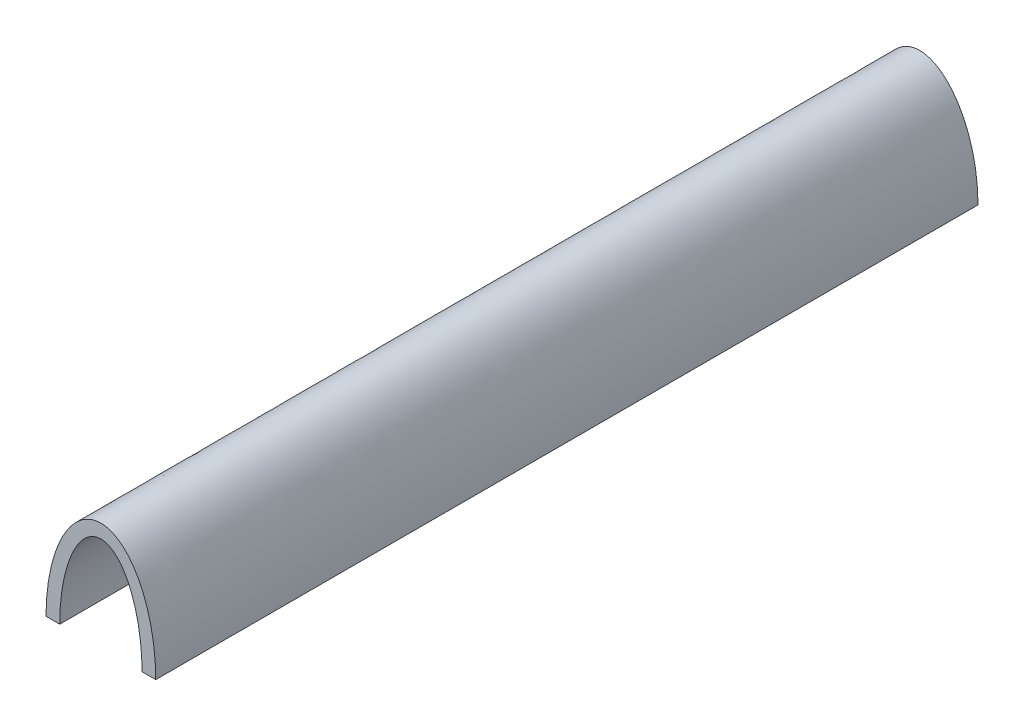
ISO-10303-21;
HEADER;
FILE_DESCRIPTION(('STEP AP214'),'2;1');
FILE_NAME('part.step','',(''),(''),'','','');
FILE_SCHEMA(('AUTOMOTIVE_DESIGN { 1 0 10303 214 1 1 1 1 }'));
ENDSEC;
DATA;
#1=APPLICATION_CONTEXT('core data for automotive mechanical design processes');
#2=APPLICATION_PROTOCOL_DEFINITION('international standard','automotive_design',2000,#1);
#3=PRODUCT_CONTEXT('',#1,'mechanical');
#4=PRODUCT('Part','Part','',(#3));
#5=PRODUCT_RELATED_PRODUCT_CATEGORY('part','',(#4));
#6=PRODUCT_DEFINITION_FORMATION('','',#4);
#7=PRODUCT_DEFINITION_CONTEXT('part definition',#1,'design');
#8=PRODUCT_DEFINITION('design','',#6,#7);
#9=PRODUCT_DEFINITION_SHAPE('','',#8);
#10=(LENGTH_UNIT() NAMED_UNIT(*) SI_UNIT(.MILLI.,.METRE.));
#11=(NAMED_UNIT(*) PLANE_ANGLE_UNIT() SI_UNIT($,.RADIAN.));
#12=(NAMED_UNIT(*) SI_UNIT($,.STERADIAN.) SOLID_ANGLE_UNIT());
#13=UNCERTAINTY_MEASURE_WITH_UNIT(LENGTH_MEASURE(1.E-05),#10,'distance_accuracy_value','');
#14=(GEOMETRIC_REPRESENTATION_CONTEXT(3) GLOBAL_UNCERTAINTY_ASSIGNED_CONTEXT((#13)) GLOBAL_UNIT_ASSIGNED_CONTEXT((#10,
#11,#12)) REPRESENTATION_CONTEXT('',''));
#15=CARTESIAN_POINT('',(0.,0.,0.));
#16=DIRECTION('',(0.,0.,1.));
#17=DIRECTION('',(1.,0.,0.));
#18=AXIS2_PLACEMENT_3D('',#15,#16,#17);
#19=CARTESIAN_POINT('',(-15.,0.,-160.401));
#20=DIRECTION('',(0.,-1.,0.));
#21=DIRECTION('',(1.,0.,0.));
#22=AXIS2_PLACEMENT_3D('',#19,#20,#21);
#23=PLANE('',#22);
#24=DIRECTION('',(1.,0.,0.));
#25=VECTOR('',#24,1.);
#26=CARTESIAN_POINT('',(20.,0.,458.85));
#27=LINE('',#26,#25);
#28=CARTESIAN_POINT('',(-20.,0.,458.85));
#29=VERTEX_POINT('',#28);
#30=CARTESIAN_POINT('',(-15.,0.,458.85));
#31=VERTEX_POINT('',#30);
#32=EDGE_CURVE('E39',#29,#31,#27,.T.);
#33=ORIENTED_EDGE('',*,*,#32,.F.);
#34=DIRECTION('',(0.,0.,1.));
#35=VECTOR('',#34,1.);
#36=CARTESIAN_POINT('',(-20.,0.,-160.401));
#37=LINE('',#36,#35);
#38=CARTESIAN_POINT('',(-20.,0.,159.148232789434));
#39=VERTEX_POINT('',#38);
#40=EDGE_CURVE('E45',#39,#29,#37,.T.);
#41=ORIENTED_EDGE('',*,*,#40,.F.);
#42=CARTESIAN_POINT('',(0.,0.,0.));
#43=DIRECTION('',(0.,-1.,0.));
#44=DIRECTION('',(1.,0.,0.));
#45=AXIS2_PLACEMENT_3D('',#42,#43,#44);
#46=CIRCLE('',#45,160.4);
#47=CARTESIAN_POINT('',(-15.,0.,159.697088264001));
#48=VERTEX_POINT('',#47);
#49=EDGE_CURVE('E60',#39,#48,#46,.F.);
#50=ORIENTED_EDGE('',*,*,#49,.T.);
#51=DIRECTION('',(0.,0.,1.));
#52=VECTOR('',#51,1.);
#53=CARTESIAN_POINT('',(-15.,0.,-160.401));
#54=LINE('',#53,#52);
#55=EDGE_CURVE('E86',#48,#31,#54,.T.);
#56=ORIENTED_EDGE('',*,*,#55,.T.);
#57=EDGE_LOOP('',(#33,#41,#50,#56));
#58=FACE_BOUND('',#57,.T.);
#59=ADVANCED_FACE('F33',(#58),#23,.T.);
#60=CARTESIAN_POINT('',(0.,0.,-160.401));
#61=DIRECTION('',(0.,0.,-1.));
#62=DIRECTION('',(0.,1.,0.));
#63=AXIS2_PLACEMENT_3D('',#60,#61,#62);
#64=ELLIPSE('',#63,34.3979999999999,15.);
#65=DIRECTION('',(0.,0.,1.));
#66=VECTOR('',#65,1.);
#67=SURFACE_OF_LINEAR_EXTRUSION('',#64,#66);
#68=CARTESIAN_POINT('',(0.,0.,458.85));
#69=DIRECTION('',(0.,0.,-1.));
#70=DIRECTION('',(0.,1.,0.));
#71=AXIS2_PLACEMENT_3D('',#68,#69,#70);
#72=ELLIPSE('',#71,34.3979999999999,15.);
#73=CARTESIAN_POINT('',(15.,0.,458.85));
#74=VERTEX_POINT('',#73);
#75=EDGE_CURVE('E87',#31,#74,#72,.T.);
#76=ORIENTED_EDGE('',*,*,#75,.F.);
#77=ORIENTED_EDGE('',*,*,#55,.F.);
#78=CARTESIAN_POINT('',(-15.,0.,159.697088264001));
#79=CARTESIAN_POINT('',(-14.9999784975551,0.65342143765804,159.697087543376));
#80=CARTESIAN_POINT('',(-14.9918800790665,1.30684677427651,159.697850840117));
#81=CARTESIAN_POINT('',(-14.9593754990692,2.61331091957095,159.700900393056));
#82=CARTESIAN_POINT('',(-14.9349687527799,3.26634971354588,159.703186703867));
#83=CARTESIAN_POINT('',(-14.8696766584003,4.57193800651891,159.709278788404));
#84=CARTESIAN_POINT('',(-14.8287827703025,5.22448707608199,159.713085349581));
#85=CARTESIAN_POINT('',(-14.7302048892875,6.52830242570223,159.722207391437));
#86=CARTESIAN_POINT('',(-14.6725210559618,7.17956871789319,159.727522857775));
#87=CARTESIAN_POINT('',(-14.5399114981972,8.48044949312844,159.739648826999));
#88=CARTESIAN_POINT('',(-14.4649827619125,9.13006366756694,159.746459591031));
#89=CARTESIAN_POINT('',(-14.2972941966738,10.4269697973111,159.761555056743));
#90=CARTESIAN_POINT('',(-14.2045345562766,11.0742617770996,159.769839742838));
#91=CARTESIAN_POINT('',(-14.0004090854731,12.3659166830814,159.787856384428));
#92=CARTESIAN_POINT('',(-13.8890425729356,13.0102795010013,159.797588392983));
#93=CARTESIAN_POINT('',(-13.6467316358289,14.295285239232,159.818464299497));
#94=CARTESIAN_POINT('',(-13.5157879659255,14.9359283019444,159.829608143031));
#95=CARTESIAN_POINT('',(-13.2687962896641,16.0513291448052,159.850274477679));
#96=CARTESIAN_POINT('',(-13.1573407691815,16.5271120686235,159.859495466801));
#97=CARTESIAN_POINT('',(-12.9221771974742,17.4756191936269,159.878676703224));
#98=CARTESIAN_POINT('',(-12.7984695046772,17.9483434838591,159.888636928897));
#99=CARTESIAN_POINT('',(-12.5381544607662,18.8898632866598,159.909260947271));
#100=CARTESIAN_POINT('',(-12.4015563433081,19.358661353483,159.919924234731));
#101=CARTESIAN_POINT('',(-12.1145179676262,20.291960338124,159.941924225481));
#102=CARTESIAN_POINT('',(-11.9640780963023,20.7564613756516,159.953260909945));
#103=CARTESIAN_POINT('',(-11.5712452595289,21.9059542244127,159.982255629428));
#104=CARTESIAN_POINT('',(-11.319810805316,22.5879050435346,160.000298264767));
#105=CARTESIAN_POINT('',(-10.9145428474105,23.6002082522044,160.028281818679));
#106=CARTESIAN_POINT('',(-10.7746210023215,23.9361865829204,160.037772400873));
#107=CARTESIAN_POINT('',(-10.4847704549664,24.603782041599,160.057023362603));
#108=CARTESIAN_POINT('',(-10.3348424691774,24.9353994797868,160.066783722792));
#109=CARTESIAN_POINT('',(-10.0204726238599,25.6015037033944,160.086774997878));
#110=CARTESIAN_POINT('',(-9.8557677552698,25.935866484536,160.097011584216));
#111=CARTESIAN_POINT('',(-9.51410448011058,26.5983400256239,160.11767897446));
#112=CARTESIAN_POINT('',(-9.33714450427164,26.9264499780088,160.128109803113));
#113=CARTESIAN_POINT('',(-8.96982758969165,27.5752858615737,160.149105703649));
#114=CARTESIAN_POINT('',(-8.77946510000341,27.896008659345,160.159670829651));
#115=CARTESIAN_POINT('',(-8.38459805007888,28.5276606081354,160.18082760338));
#116=CARTESIAN_POINT('',(-8.18012630862486,28.8386101909142,160.191419137773));
#117=CARTESIAN_POINT('',(-7.75530919077876,29.4493687130793,160.212547590858));
#118=CARTESIAN_POINT('',(-7.53496897633811,29.7491812276347,160.223084526128));
#119=CARTESIAN_POINT('',(-7.0769075190019,30.3349810431125,160.243970044648));
#120=CARTESIAN_POINT('',(-6.83919934567137,30.6209784762103,160.254318762357));
#121=CARTESIAN_POINT('',(-6.41396402380304,31.0980468433213,160.271808907401));
#122=CARTESIAN_POINT('',(-6.23106537594444,31.293241255501,160.279035698137));
#123=CARTESIAN_POINT('',(-5.85465695055068,31.6731750798582,160.293226539017));
#124=CARTESIAN_POINT('',(-5.66114739273328,31.8579147083598,160.300190594594));
#125=CARTESIAN_POINT('',(-5.26297287175353,32.2149138995068,160.313757318548));
#126=CARTESIAN_POINT('',(-5.05831086934248,32.3871767464751,160.320360081915));
#127=CARTESIAN_POINT('',(-4.63732348729601,32.7168752280081,160.333089415243));
#128=CARTESIAN_POINT('',(-4.42099975034745,32.8743129423229,160.339216051976));
#129=CARTESIAN_POINT('',(-4.0105112563571,33.1487781126818,160.349964906802));
#130=CARTESIAN_POINT('',(-3.81802179495408,33.2683025793105,160.354673868227));
#131=CARTESIAN_POINT('',(-3.42468906539296,33.4926983751485,160.3635562644));
#132=CARTESIAN_POINT('',(-3.22384813272875,33.5975737656916,160.36772984755));
#133=CARTESIAN_POINT('',(-2.8144674930993,33.7904696576536,160.375436477919));
#134=CARTESIAN_POINT('',(-2.60593728909384,33.8785101836218,160.378970285861));
#135=CARTESIAN_POINT('',(-2.18185654152479,34.0357230563317,160.385299903719));
#136=CARTESIAN_POINT('',(-1.96630751661237,34.1048994547059,160.388095872105));
#137=CARTESIAN_POINT('',(-1.56663767526799,34.2124375921232,160.392451641299));
#138=CARTESIAN_POINT('',(-1.38338694018583,34.2540357349852,160.394140673959));
#139=CARTESIAN_POINT('',(-1.01406477385361,34.3219324489244,160.396900699211));
#140=CARTESIAN_POINT('',(-0.827993651654338,34.3482326840482,160.397971759025));
#141=CARTESIAN_POINT('',(-0.454364770533323,34.3848879643377,160.399465195958));
#142=CARTESIAN_POINT('',(-0.266807741603291,34.3952504036748,160.399887873887));
#143=CARTESIAN_POINT('',(0.108508977346256,34.3997918538337,160.400073069847));
#144=CARTESIAN_POINT('',(0.296268672403645,34.3939704526438,160.39983557107));
#145=CARTESIAN_POINT('',(0.670410131620379,34.3663049092713,160.398707960718));
#146=CARTESIAN_POINT('',(0.856793063102839,34.3444764317277,160.397818487169));
#147=CARTESIAN_POINT('',(1.22706699508122,34.2853535764004,160.395413248255));
#148=CARTESIAN_POINT('',(1.41095803633666,34.2480594519026,160.393897493147));
#149=CARTESIAN_POINT('',(1.77525623638912,34.1588321910972,160.390279234179));
#150=CARTESIAN_POINT('',(1.95566108737648,34.1068896901012,160.388176354981));
#151=CARTESIAN_POINT('',(2.31201066613865,33.989450812235,160.383435509002));
#152=CARTESIAN_POINT('',(2.48795424409261,33.9239509802498,160.380797405821));
#153=CARTESIAN_POINT('',(2.90112879401637,33.7531295322364,160.373940950107));
#154=CARTESIAN_POINT('',(3.1360353307911,33.6421626616487,160.369504274004));
#155=CARTESIAN_POINT('',(3.59500604380829,33.3998474927477,160.359872431743));
#156=CARTESIAN_POINT('',(3.81906611710066,33.2684915595776,160.354676981499));
#157=CARTESIAN_POINT('',(4.47520267853596,32.8479639735701,160.338156287505));
#158=CARTESIAN_POINT('',(4.89068277109205,32.5325741897963,160.325906516323));
#159=CARTESIAN_POINT('',(5.44786435829338,32.0516350909398,160.307540579025));
#160=CARTESIAN_POINT('',(5.60779448063387,31.9060991504798,160.30201854851));
#161=CARTESIAN_POINT('',(5.92053786885692,31.6075743052417,160.29077231437));
#162=CARTESIAN_POINT('',(6.07335259498055,31.4545869429683,160.285048152655));
#163=CARTESIAN_POINT('',(6.5217982399784,30.9857308318328,160.267638258022));
#164=CARTESIAN_POINT('',(6.80725795512427,30.6601198361694,160.255720935196));
#165=CARTESIAN_POINT('',(7.35419871687169,29.9885453274334,160.231553609287));
#166=CARTESIAN_POINT('',(7.61563210558807,29.642543506556,160.219303004916));
#167=CARTESIAN_POINT('',(8.11649577122827,28.9351465593391,160.194710659406));
#168=CARTESIAN_POINT('',(8.3559301267817,28.5737543046493,160.18236893562));
#169=CARTESIAN_POINT('',(8.81793256109715,27.8342323620122,160.157604292512));
#170=CARTESIAN_POINT('',(9.04025762419912,27.4559517078691,160.145182235188));
#171=CARTESIAN_POINT('',(9.4668754185498,26.6891191263502,160.120529364611));
#172=CARTESIAN_POINT('',(9.67115801913654,26.3005615857119,160.108298661934));
#173=CARTESIAN_POINT('',(10.0633759224214,25.515010213893,160.084124999376));
#174=CARTESIAN_POINT('',(10.2513012074375,25.1180113956395,160.072182219019));
#175=CARTESIAN_POINT('',(10.6121119404103,24.3172319689039,160.048666823684));
#176=CARTESIAN_POINT('',(10.7849968246209,23.9134511068925,160.037094222591));
#177=CARTESIAN_POINT('',(11.1177624404058,23.0982193007242,160.014322173551));
#178=CARTESIAN_POINT('',(11.277573982482,22.6867401385426,160.003124875597));
#179=CARTESIAN_POINT('',(11.5841960222741,21.8591920863931,159.98121766676));
#180=CARTESIAN_POINT('',(11.7310127426551,21.4431255016663,159.970507523808));
#181=CARTESIAN_POINT('',(12.0125957685302,20.6070006319153,159.949609153573));
#182=CARTESIAN_POINT('',(12.1473639016847,20.1869429630331,159.939420847232));
#183=CARTESIAN_POINT('',(12.4056235637172,19.3433824788189,159.919596231425));
#184=CARTESIAN_POINT('',(12.5291153024456,18.9198797277588,159.909959911686));
#185=CARTESIAN_POINT('',(12.8163045489906,17.8871344304275,159.887245096027));
#186=CARTESIAN_POINT('',(12.9744537751133,17.276337922186,159.87446845038));
#187=CARTESIAN_POINT('',(13.2706353589373,16.0497283687574,159.850155712863));
#188=CARTESIAN_POINT('',(13.4086626311399,15.4339140967911,159.838619934794));
#189=CARTESIAN_POINT('',(13.6658708145789,14.1980669228278,159.816834638868));
#190=CARTESIAN_POINT('',(13.7850434043122,13.5780322833935,159.806585689362));
#191=CARTESIAN_POINT('',(14.0055322987772,12.3345089612796,159.78741284954));
#192=CARTESIAN_POINT('',(14.1068408326325,11.711018896527,159.778489536141));
#193=CARTESIAN_POINT('',(14.2923797300089,10.4613046311319,159.761999715897));
#194=CARTESIAN_POINT('',(14.3766050714477,9.8350796816032,159.754433608116));
#195=CARTESIAN_POINT('',(14.5266965832751,8.59620107608555,159.740854553545));
#196=CARTESIAN_POINT('',(14.5929667074856,7.98359655904778,159.734807704585));
#197=CARTESIAN_POINT('',(14.7102912328897,6.75707343454961,159.724045786877));
#198=CARTESIAN_POINT('',(14.7613493145002,6.14315518119767,159.719330396008));
#199=CARTESIAN_POINT('',(14.848586270049,4.91466252495811,159.711243774186));
#200=CARTESIAN_POINT('',(14.8847749189711,4.30008882027103,159.707871660223));
#201=CARTESIAN_POINT('',(14.942532868406,3.07093883127636,159.70247837567));
#202=CARTESIAN_POINT('',(14.9641184548951,2.45636331677159,159.700455700161));
#203=CARTESIAN_POINT('',(14.9928320832156,1.22785720203371,159.697761444279));
#204=CARTESIAN_POINT('',(14.9999832511626,0.613927147787333,159.697087702724));
#205=CARTESIAN_POINT('',(15.,0.,159.697088264001));
#206=B_SPLINE_CURVE_WITH_KNOTS('',3,(#78,#79,#80,#81,#82,#83,#84,#85,#86,#87,#88,#89,#90,#91,
#92,#93,#94,#95,#96,#97,#98,#99,#100,#101,#102,#103,#104,#105,#106,#107,#108,#109,#110,#111,
#112,#113,#114,#115,#116,#117,#118,#119,#120,#121,#122,#123,#124,#125,#126,#127,#128,#129,#130,
#131,#132,#133,#134,#135,#136,#137,#138,#139,#140,#141,#142,#143,#144,#145,#146,#147,#148,#149,
#150,#151,#152,#153,#154,#155,#156,#157,#158,#159,#160,#161,#162,#163,#164,#165,#166,#167,#168,
#169,#170,#171,#172,#173,#174,#175,#176,#177,#178,#179,#180,#181,#182,#183,#184,#185,#186,#187,
#188,#189,#190,#191,#192,#193,#194,#195,#196,#197,#198,#199,#200,#201,#202,#203,#204,#205),
.UNSPECIFIED.,.F.,.F.,(4,2,2,2,2,2,2,2,2,2,2,2,2,2,2,2,2,2,2,2,2,2,2,2,2,2,2,2,2,2,2,2,2,2,2,2,
2,2,2,2,2,2,2,2,2,2,2,2,2,2,2,2,2,2,2,2,2,2,2,2,2,2,2,4),(0.,1.96021998641674,3.92051026576229,
5.8818172432263,7.84310557870457,9.80473671615564,11.7663471110368,13.7280294346628,
15.6896361582854,17.1557395245712,18.621800013815,20.0868181943761,21.5517954376809,
23.7318221855066,24.8239146135078,25.9159289273388,27.0343064366619,28.1528274202736,
29.2718144206562,30.388281058326,31.504386140133,32.6196598242085,33.4220812775888,
34.2244861216749,35.0266789714043,35.8287591169897,36.5080900929693,37.187232354705,
37.86556170306,38.5437452450601,39.1069052977088,39.6700040805478,40.2328415407902,
40.7956933300002,41.3579950422607,41.9202875458959,42.482940340503,43.0457367053375,
43.8239961209895,44.6025476686493,46.1614392153209,46.8102618354326,47.4589507101652,
48.7570157382015,50.057602371106,51.3579473860921,52.674248715483,53.9912844975801,
55.3091212762197,56.6270074289113,57.9514692900106,59.2752934522727,60.5989164605871,
61.9225148316393,63.81532346879,65.7086096564838,67.6027291278803,69.4976705207524,
71.3931681798012,73.2415975618055,75.0895793691127,76.9363443845329,78.781046396232,
80.6227905636689),.UNSPECIFIED.);
#207=CARTESIAN_POINT('',(15.,0.,159.697088264001));
#208=VERTEX_POINT('',#207);
#209=EDGE_CURVE('E105',#48,#208,#206,.T.);
#210=ORIENTED_EDGE('',*,*,#209,.T.);
#211=DIRECTION('',(0.,0.,1.));
#212=VECTOR('',#211,1.);
#213=CARTESIAN_POINT('',(15.,0.,-160.401));
#214=LINE('',#213,#212);
#215=EDGE_CURVE('E102',#208,#74,#214,.T.);
#216=ORIENTED_EDGE('',*,*,#215,.T.);
#217=EDGE_LOOP('',(#76,#77,#210,#216));
#218=FACE_BOUND('',#217,.T.);
#219=ADVANCED_FACE('F122',(#218),#67,.T.);
#220=CARTESIAN_POINT('',(20.,0.,-160.401));
#221=DIRECTION('',(0.,-1.,0.));
#222=DIRECTION('',(1.,0.,0.));
#223=AXIS2_PLACEMENT_3D('',#220,#221,#222);
#224=PLANE('',#223);
#225=CARTESIAN_POINT('',(20.,0.,458.85));
#226=VERTEX_POINT('',#225);
#227=EDGE_CURVE('E52',#74,#226,#27,.T.);
#228=ORIENTED_EDGE('',*,*,#227,.F.);
#229=ORIENTED_EDGE('',*,*,#215,.F.);
#230=CARTESIAN_POINT('',(0.,0.,0.));
#231=DIRECTION('',(0.,-1.,0.));
#232=DIRECTION('',(1.,0.,0.));
#233=AXIS2_PLACEMENT_3D('',#230,#231,#232);
#234=CIRCLE('',#233,160.4);
#235=CARTESIAN_POINT('',(20.,0.,159.148232789434));
#236=VERTEX_POINT('',#235);
#237=EDGE_CURVE('E104',#208,#236,#234,.F.);
#238=ORIENTED_EDGE('',*,*,#237,.T.);
#239=DIRECTION('',(0.,0.,1.));
#240=VECTOR('',#239,1.);
#241=CARTESIAN_POINT('',(20.,0.,-160.401));
#242=LINE('',#241,#240);
#243=EDGE_CURVE('E90',#236,#226,#242,.T.);
#244=ORIENTED_EDGE('',*,*,#243,.T.);
#245=EDGE_LOOP('',(#228,#229,#238,#244));
#246=FACE_BOUND('',#245,.T.);
#247=ADVANCED_FACE('F120',(#246),#224,.T.);
#248=CARTESIAN_POINT('',(0.,0.,-160.401));
#249=DIRECTION('',(0.,0.,1.));
#250=DIRECTION('',(0.,1.,0.));
#251=AXIS2_PLACEMENT_3D('',#248,#249,#250);
#252=ELLIPSE('',#251,39.3979999999998,20.);
#253=DIRECTION('',(0.,0.,1.));
#254=VECTOR('',#253,1.);
#255=SURFACE_OF_LINEAR_EXTRUSION('',#252,#254);
#256=CARTESIAN_POINT('',(0.,0.,458.85));
#257=DIRECTION('',(0.,0.,1.));
#258=DIRECTION('',(0.,1.,0.));
#259=AXIS2_PLACEMENT_3D('',#256,#257,#258);
#260=ELLIPSE('',#259,39.3979999999998,20.);
#261=EDGE_CURVE('E11',#226,#29,#260,.T.);
#262=ORIENTED_EDGE('',*,*,#261,.F.);
#263=ORIENTED_EDGE('',*,*,#243,.F.);
#264=CARTESIAN_POINT('',(20.,0.,159.148232789434));
#265=CARTESIAN_POINT('',(19.9999791161653,0.715631453697638,159.1482313142));
#266=CARTESIAN_POINT('',(19.9901010197174,1.43126725201201,159.149476623041));
#267=CARTESIAN_POINT('',(19.950480550443,2.86200488832252,159.154450377337));
#268=CARTESIAN_POINT('',(19.920737469623,3.57710670637801,159.158178911295));
#269=CARTESIAN_POINT('',(19.8412177896922,5.00653084539131,159.168111102376));
#270=CARTESIAN_POINT('',(19.7914314349536,5.7208526166648,159.174315964784));
#271=CARTESIAN_POINT('',(19.6715240035032,7.14775913956365,159.189179348453));
#272=CARTESIAN_POINT('',(19.6014031106455,7.86034390683533,159.197837847529));
#273=CARTESIAN_POINT('',(19.4403900136294,9.28326353753976,159.217580104619));
#274=CARTESIAN_POINT('',(19.3494940999102,9.99359797616326,159.228664295745));
#275=CARTESIAN_POINT('',(19.1463740307646,11.4111705275281,159.253216094441));
#276=CARTESIAN_POINT('',(19.0341500793435,12.1184086698197,159.266683679212));
#277=CARTESIAN_POINT('',(18.7876473751782,13.5290264328626,159.29595009523));
#278=CARTESIAN_POINT('',(18.6533675351971,14.2324058616328,159.311749041397));
#279=CARTESIAN_POINT('',(18.3618635075583,15.6343361898646,159.345610313208));
#280=CARTESIAN_POINT('',(18.2046400424915,16.3328872406668,159.363672567569));
#281=CARTESIAN_POINT('',(17.897944986015,17.5933878053418,159.398377234711));
#282=CARTESIAN_POINT('',(17.7525663818889,18.1563449299556,159.414648872089));
#283=CARTESIAN_POINT('',(17.445244532966,19.2776698392358,159.448572755624));
#284=CARTESIAN_POINT('',(17.2833018004822,19.8360377652651,159.466224959077));
#285=CARTESIAN_POINT('',(16.9421435795873,20.9470245657059,159.502831359103));
#286=CARTESIAN_POINT('',(16.7629401319162,21.4996471540491,159.521784645451));
#287=CARTESIAN_POINT('',(16.3862209455228,22.598539695771,159.560921121981));
#288=CARTESIAN_POINT('',(16.1887056360678,23.1448097977272,159.58110428333));
#289=CARTESIAN_POINT('',(15.6672120844895,24.5101776646319,159.633325886748));
#290=CARTESIAN_POINT('',(15.3305940577112,25.3245111313698,159.666104814178));
#291=CARTESIAN_POINT('',(14.7883980448012,26.5299224153071,159.716924793829));
#292=CARTESIAN_POINT('',(14.6012648470911,26.9294054107051,159.734156696487));
#293=CARTESIAN_POINT('',(14.2139108783122,27.7219420797171,159.769091562283));
#294=CARTESIAN_POINT('',(14.013691169403,28.114996271892,159.78679448712));
#295=CARTESIAN_POINT('',(13.5879436461479,28.9152249668547,159.823577508841));
#296=CARTESIAN_POINT('',(13.3616288494255,29.3219807794147,159.842679674643));
#297=CARTESIAN_POINT('',(12.8925243644816,30.1259145285523,159.881200320302));
#298=CARTESIAN_POINT('',(12.6497339530454,30.5230920436417,159.900618814017));
#299=CARTESIAN_POINT('',(12.1465828468041,31.3061248680215,159.939626735476));
#300=CARTESIAN_POINT('',(11.8862240204422,31.6919813750853,159.95921614485));
#301=CARTESIAN_POINT('',(11.347318042936,32.4494425675168,159.998347484381));
#302=CARTESIAN_POINT('',(11.0688157073454,32.8210790201614,160.017889416452));
#303=CARTESIAN_POINT('',(10.4917015530054,33.5485939088665,160.056764524585));
#304=CARTESIAN_POINT('',(10.1930855435256,33.9044690352572,160.076097656161));
#305=CARTESIAN_POINT('',(9.57406286170302,34.5976483969633,160.114314199185));
#306=CARTESIAN_POINT('',(9.25363057354844,34.9349299296531,160.133197045551));
#307=CARTESIAN_POINT('',(8.64870611139886,35.5288816962999,160.166896319309));
#308=CARTESIAN_POINT('',(8.36787014759872,35.7892640410103,160.181841638236));
#309=CARTESIAN_POINT('',(7.79015721646228,36.2918009800959,160.210976870085));
#310=CARTESIAN_POINT('',(7.49327823113452,36.5339532721703,160.225166687528));
#311=CARTESIAN_POINT('',(6.88386544523483,36.9963143391859,160.252504516342));
#312=CARTESIAN_POINT('',(6.57136941730129,37.2165725431049,160.265654860047));
#313=CARTESIAN_POINT('',(5.93011438538727,37.6321856016405,160.290662973099));
#314=CARTESIAN_POINT('',(5.6013571158366,37.8275431042583,160.302520879868));
#315=CARTESIAN_POINT('',(4.98403675447259,38.1593617527437,160.322794022043));
#316=CARTESIAN_POINT('',(4.6978457539045,38.3002177039736,160.331454090828));
#317=CARTESIAN_POINT('',(4.11548374605023,38.5593436902265,160.347458878487));
#318=CARTESIAN_POINT('',(3.81931761350136,38.6776245743073,160.354804229078));
#319=CARTESIAN_POINT('',(3.21830457545587,38.8892203100325,160.36799177081));
#320=CARTESIAN_POINT('',(2.91346260972101,38.9825490660223,160.373834799037));
#321=CARTESIAN_POINT('',(2.29670301757319,39.1421594171804,160.383852831572));
#322=CARTESIAN_POINT('',(1.98478525630675,39.2084404964047,160.38802780406));
#323=CARTESIAN_POINT('',(1.35398450339604,39.3125894533744,160.394597381253));
#324=CARTESIAN_POINT('',(1.03506835110327,39.3502586636996,160.396979536448));
#325=CARTESIAN_POINT('',(0.395084580347254,39.3953613535367,160.39983257769));
#326=CARTESIAN_POINT('',(0.0740169779386114,39.4027950584216,160.400303477983));
#327=CARTESIAN_POINT('',(-0.567377496949093,39.3872111795675,160.399317150532));
#328=CARTESIAN_POINT('',(-0.887704347499093,39.3641927056023,160.397859866418));
#329=CARTESIAN_POINT('',(-1.52477314614619,39.2883653334538,160.393068858729));
#330=CARTESIAN_POINT('',(-1.8415152092096,39.2355573934142,160.389735195505));
#331=CARTESIAN_POINT('',(-2.4364688106696,39.108529640945,160.381740916178));
#332=CARTESIAN_POINT('',(-2.71528211425982,39.037083401849,160.377252836405));
#333=CARTESIAN_POINT('',(-3.26647523375408,38.8728620279814,160.366973267557));
#334=CARTESIAN_POINT('',(-3.53885573196646,38.7800891665664,160.361181917408));
#335=CARTESIAN_POINT('',(-4.07605816724365,38.5748786695068,160.348426741749));
#336=CARTESIAN_POINT('',(-4.34087979970863,38.462440242696,160.341462869068));
#337=CARTESIAN_POINT('',(-4.86225023164435,38.2196310721218,160.326499979844));
#338=CARTESIAN_POINT('',(-5.11879477834403,38.0892512856606,160.318500441432));
#339=CARTESIAN_POINT('',(-5.76309187136201,37.7354127353333,160.29691430362));
#340=CARTESIAN_POINT('',(-6.14455367997981,37.5004853337591,160.282692853224));
#341=CARTESIAN_POINT('',(-6.8852342216665,36.9978049980172,160.252585435199));
#342=CARTESIAN_POINT('',(-7.24444021044453,36.7300335131828,160.236698527646));
#343=CARTESIAN_POINT('',(-7.76695908035413,36.3076617183495,160.211937212026));
#344=CARTESIAN_POINT('',(-7.9386273175063,36.1632194914785,160.203516847397));
#345=CARTESIAN_POINT('',(-8.27641778184126,35.8681427350296,160.186421060202));
#346=CARTESIAN_POINT('',(-8.4425422962345,35.7175108178715,160.177745745673));
#347=CARTESIAN_POINT('',(-8.9329050803779,35.257050298055,160.151398583347));
#348=CARTESIAN_POINT('',(-9.24913303282053,34.9386565666727,160.133405495622));
#349=CARTESIAN_POINT('',(-9.81194439850644,34.3357126013956,160.099818531387));
#350=CARTESIAN_POINT('',(-10.061551327312,34.053950217187,160.084303968698));
#351=CARTESIAN_POINT('',(-10.547151383275,33.4789042298212,160.053043700378));
#352=CARTESIAN_POINT('',(-10.7831431996139,33.1856195218866,160.037297972674));
#353=CARTESIAN_POINT('',(-11.2423067613197,32.5889713921479,160.005698441938));
#354=CARTESIAN_POINT('',(-11.4654718004724,32.285602826698,159.989844587134));
#355=CARTESIAN_POINT('',(-11.8995582190149,31.6702086116618,159.958143955029));
#356=CARTESIAN_POINT('',(-12.1104781475648,31.3581819426825,159.942297178788));
#357=CARTESIAN_POINT('',(-12.7264721015348,30.4098650605532,159.894862827826));
#358=CARTESIAN_POINT('',(-13.1141306182691,29.7621936682765,159.863426759002));
#359=CARTESIAN_POINT('',(-13.8477105119046,28.4435721394418,159.801552747701));
#360=CARTESIAN_POINT('',(-14.1936197366805,27.7726152979194,159.771115097706));
#361=CARTESIAN_POINT('',(-14.7239964504687,26.6695154272654,159.722902171159));
#362=CARTESIAN_POINT('',(-14.9200820176949,26.2429214917988,159.704687709387));
#363=CARTESIAN_POINT('',(-15.2984057845831,25.3836062802894,159.668891340202));
#364=CARTESIAN_POINT('',(-15.4806435779366,24.9508848249002,159.651309451359));
#365=CARTESIAN_POINT('',(-16.0079246120081,23.6442073464598,159.599597783244));
#366=CARTESIAN_POINT('',(-16.3333061875845,22.7622206422495,159.566523171494));
#367=CARTESIAN_POINT('',(-16.9365334080338,20.9818816185518,159.503622365673));
#368=CARTESIAN_POINT('',(-17.2143634113276,20.0835240211411,159.473797241653));
#369=CARTESIAN_POINT('',(-17.7266325455482,18.2727510147548,159.417668309892));
#370=CARTESIAN_POINT('',(-17.9609945546182,17.3603136729874,159.391370783334));
#371=CARTESIAN_POINT('',(-18.3886016660437,15.526212817195,159.342604272149));
#372=CARTESIAN_POINT('',(-18.5818638523465,14.6045533040096,159.320133697549));
#373=CARTESIAN_POINT('',(-18.9296619153217,12.7540484180199,159.27918430954));
#374=CARTESIAN_POINT('',(-19.0842046285862,11.8252043436731,159.260704791521));
#375=CARTESIAN_POINT('',(-19.3083364122071,10.2906390033272,159.23365191242));
#376=CARTESIAN_POINT('',(-19.3886652797077,9.68647948251359,159.223883277204));
#377=CARTESIAN_POINT('',(-19.534185137702,8.47635268823007,159.206096020255));
#378=CARTESIAN_POINT('',(-19.5993772351566,7.87038555023696,159.198077270553));
#379=CARTESIAN_POINT('',(-19.7149182767842,6.65703174729095,159.183810041524));
#380=CARTESIAN_POINT('',(-19.7652674599553,6.04964510535341,159.177561533692));
#381=CARTESIAN_POINT('',(-19.8510367157886,4.83812040197731,159.166887834801));
#382=CARTESIAN_POINT('',(-19.8865598304466,4.23398973694763,159.162450064018));
#383=CARTESIAN_POINT('',(-19.9433403365411,3.0250457063062,159.155345625586));
#384=CARTESIAN_POINT('',(-19.9645976438526,2.42023233668962,159.15267896838));
#385=CARTESIAN_POINT('',(-19.9929220295845,1.21027869378324,159.149122191389));
#386=CARTESIAN_POINT('',(-19.9999893618942,0.605138426536122,159.148232039818));
#387=CARTESIAN_POINT('',(-20.,0.,159.148232789434));
#388=B_SPLINE_CURVE_WITH_KNOTS('',3,(#264,#265,#266,#267,#268,#269,#270,#271,#272,#273,#274,
#275,#276,#277,#278,#279,#280,#281,#282,#283,#284,#285,#286,#287,#288,#289,#290,#291,#292,#293,
#294,#295,#296,#297,#298,#299,#300,#301,#302,#303,#304,#305,#306,#307,#308,#309,#310,#311,#312,
#313,#314,#315,#316,#317,#318,#319,#320,#321,#322,#323,#324,#325,#326,#327,#328,#329,#330,#331,
#332,#333,#334,#335,#336,#337,#338,#339,#340,#341,#342,#343,#344,#345,#346,#347,#348,#349,#350,
#351,#352,#353,#354,#355,#356,#357,#358,#359,#360,#361,#362,#363,#364,#365,#366,#367,#368,#369,
#370,#371,#372,#373,#374,#375,#376,#377,#378,#379,#380,#381,#382,#383,#384,#385,#386,#387),
.UNSPECIFIED.,.F.,.F.,(4,2,2,2,2,2,2,2,2,2,2,2,2,2,2,2,2,2,2,2,2,2,2,2,2,2,2,2,2,2,2,2,2,2,2,2,
2,2,2,2,2,2,2,2,2,2,2,2,2,2,2,2,2,2,2,2,2,2,2,2,2,4),(0.,2.14683213591378,4.2937407896089,
6.44169567022075,8.58963113078258,10.7379504239685,12.8862491692347,15.0346538458958,
17.1829908748911,18.9277153028307,20.672385784387,22.4158479125314,24.1592691806972,
26.8028688535464,28.1271117796196,29.451247357375,30.8484969053233,32.2458078267571,
33.6429703743266,35.0368038949508,36.4309287277375,37.8267196985022,38.9758381819075,
40.1251015466006,41.2717083688481,42.4181931562206,43.3746096429277,44.330565334122,
45.2859872121875,46.2414273144064,47.2034423829498,48.1654502806977,49.1274863019985,
50.0894913822885,50.952174344925,51.8147653906452,52.677391147287,53.5404532828429,
54.8830148875793,56.2263383068226,56.89973475279,57.5728498470715,58.9190783281399,
60.0488864593083,61.1788031838037,62.3093053863628,63.4399412622307,65.7044306798857,
67.9695776495676,69.3789066814796,70.7882770486756,73.6086187350293,76.4298863669178,
79.2561126460086,82.081161842539,84.9057118757248,86.7342007102498,88.5625557841548,
90.3908814165735,92.2062795157584,94.0216883201929,95.8370646427501),.UNSPECIFIED.);
#389=EDGE_CURVE('E88',#236,#39,#388,.T.);
#390=ORIENTED_EDGE('',*,*,#389,.T.);
#391=ORIENTED_EDGE('',*,*,#40,.T.);
#392=EDGE_LOOP('',(#262,#263,#390,#391));
#393=FACE_BOUND('',#392,.T.);
#394=ADVANCED_FACE('F35',(#393),#255,.T.);
#395=CARTESIAN_POINT('',(0.,40.7,1.2139818183393E-13));
#396=DIRECTION('',(0.,1.,0.));
#397=DIRECTION('',(-1.,0.,0.));
#398=AXIS2_PLACEMENT_3D('',#395,#396,#397);
#399=CYLINDRICAL_SURFACE('',#398,160.4);
#400=ORIENTED_EDGE('',*,*,#389,.F.);
#401=ORIENTED_EDGE('',*,*,#237,.F.);
#402=ORIENTED_EDGE('',*,*,#209,.F.);
#403=ORIENTED_EDGE('',*,*,#49,.F.);
#404=EDGE_LOOP('',(#400,#401,#402,#403));
#405=FACE_BOUND('',#404,.T.);
#406=ADVANCED_FACE('F116',(#405),#399,.F.);
#407=CARTESIAN_POINT('',(20.,42.0487493089471,458.85));
#408=DIRECTION('',(0.,0.,-1.));
#409=DIRECTION('',(-1.,0.,0.));
#410=AXIS2_PLACEMENT_3D('',#407,#408,#409);
#411=PLANE('',#410);
#412=ORIENTED_EDGE('',*,*,#75,.T.);
#413=ORIENTED_EDGE('',*,*,#227,.T.);
#414=ORIENTED_EDGE('',*,*,#261,.T.);
#415=ORIENTED_EDGE('',*,*,#32,.T.);
#416=EDGE_LOOP('',(#412,#413,#414,#415));
#417=FACE_BOUND('',#416,.T.);
#418=ADVANCED_FACE('F76',(#417),#411,.F.);
#419=CLOSED_SHELL('',(#59,#219,#247,#394,#406,#418));
#420=MANIFOLD_SOLID_BREP('B2',#419);
#421=ADVANCED_BREP_SHAPE_REPRESENTATION('',(#18,#420),#14);
#422=SHAPE_DEFINITION_REPRESENTATION(#9,#421);
ENDSEC;
END-ISO-10303-21;
